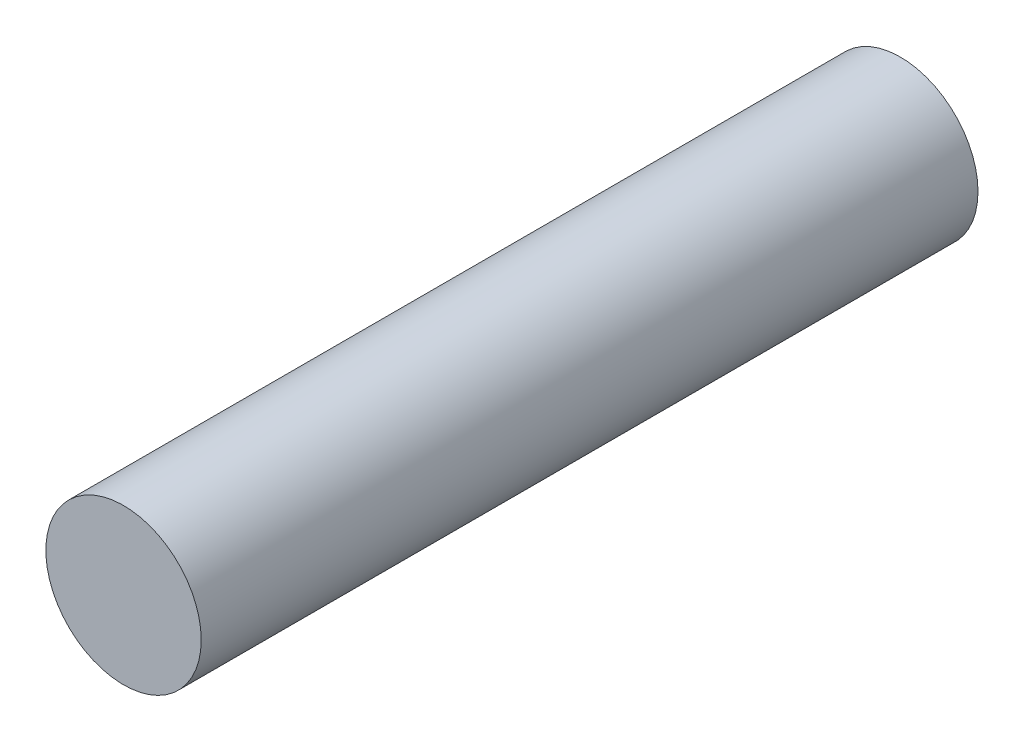
ISO-10303-21;
HEADER;
FILE_DESCRIPTION(('STEP AP214'),'2;1');
FILE_NAME('part.step','',(''),(''),'','','');
FILE_SCHEMA(('AUTOMOTIVE_DESIGN { 1 0 10303 214 1 1 1 1 }'));
ENDSEC;
DATA;
#1=APPLICATION_CONTEXT('core data for automotive mechanical design processes');
#2=APPLICATION_PROTOCOL_DEFINITION('international standard','automotive_design',2000,#1);
#3=PRODUCT_CONTEXT('',#1,'mechanical');
#4=PRODUCT('Part','Part','',(#3));
#5=PRODUCT_RELATED_PRODUCT_CATEGORY('part','',(#4));
#6=PRODUCT_DEFINITION_FORMATION('','',#4);
#7=PRODUCT_DEFINITION_CONTEXT('part definition',#1,'design');
#8=PRODUCT_DEFINITION('design','',#6,#7);
#9=PRODUCT_DEFINITION_SHAPE('','',#8);
#10=(LENGTH_UNIT() NAMED_UNIT(*) SI_UNIT(.MILLI.,.METRE.));
#11=(NAMED_UNIT(*) PLANE_ANGLE_UNIT() SI_UNIT($,.RADIAN.));
#12=(NAMED_UNIT(*) SI_UNIT($,.STERADIAN.) SOLID_ANGLE_UNIT());
#13=UNCERTAINTY_MEASURE_WITH_UNIT(LENGTH_MEASURE(1.E-05),#10,'distance_accuracy_value','');
#14=(GEOMETRIC_REPRESENTATION_CONTEXT(3) GLOBAL_UNCERTAINTY_ASSIGNED_CONTEXT((#13)) GLOBAL_UNIT_ASSIGNED_CONTEXT((#10,
#11,#12)) REPRESENTATION_CONTEXT('',''));
#15=CARTESIAN_POINT('',(0.,0.,0.));
#16=DIRECTION('',(0.,0.,1.));
#17=DIRECTION('',(1.,0.,0.));
#18=AXIS2_PLACEMENT_3D('',#15,#16,#17);
#19=CARTESIAN_POINT('',(0.,0.,150.));
#20=DIRECTION('',(0.,0.,-1.));
#21=DIRECTION('',(-1.,0.,0.));
#22=AXIS2_PLACEMENT_3D('',#19,#20,#21);
#23=CYLINDRICAL_SURFACE('',#22,15.);
#24=CARTESIAN_POINT('',(0.,0.,150.));
#25=DIRECTION('',(0.,0.,1.));
#26=DIRECTION('',(1.,0.,0.));
#27=AXIS2_PLACEMENT_3D('',#24,#25,#26);
#28=CIRCLE('',#27,15.);
#29=CARTESIAN_POINT('',(15.,0.,150.));
#30=VERTEX_POINT('',#29);
#31=EDGE_CURVE('E10',#30,#30,#28,.T.);
#32=ORIENTED_EDGE('',*,*,#31,.F.);
#33=EDGE_LOOP('',(#32));
#34=FACE_BOUND('',#33,.T.);
#35=CARTESIAN_POINT('',(0.,0.,0.));
#36=DIRECTION('',(0.,0.,1.));
#37=DIRECTION('',(1.,0.,0.));
#38=AXIS2_PLACEMENT_3D('',#35,#36,#37);
#39=CIRCLE('',#38,15.);
#40=CARTESIAN_POINT('',(15.,0.,0.));
#41=VERTEX_POINT('',#40);
#42=EDGE_CURVE('E46',#41,#41,#39,.T.);
#43=ORIENTED_EDGE('',*,*,#42,.T.);
#44=EDGE_LOOP('',(#43));
#45=FACE_BOUND('',#44,.T.);
#46=ADVANCED_FACE('F43',(#34,#45),#23,.T.);
#47=CARTESIAN_POINT('',(0.,0.,150.));
#48=DIRECTION('',(0.,0.,1.));
#49=DIRECTION('',(1.,0.,0.));
#50=AXIS2_PLACEMENT_3D('',#47,#48,#49);
#51=PLANE('',#50);
#52=ORIENTED_EDGE('',*,*,#31,.T.);
#53=EDGE_LOOP('',(#52));
#54=FACE_BOUND('',#53,.T.);
#55=ADVANCED_FACE('F58',(#54),#51,.T.);
#56=CARTESIAN_POINT('',(0.,0.,0.));
#57=DIRECTION('',(0.,0.,1.));
#58=DIRECTION('',(1.,0.,0.));
#59=AXIS2_PLACEMENT_3D('',#56,#57,#58);
#60=PLANE('',#59);
#61=ORIENTED_EDGE('',*,*,#42,.F.);
#62=EDGE_LOOP('',(#61));
#63=FACE_BOUND('',#62,.T.);
#64=ADVANCED_FACE('F56',(#63),#60,.F.);
#65=CLOSED_SHELL('',(#46,#55,#64));
#66=MANIFOLD_SOLID_BREP('B2',#65);
#67=ADVANCED_BREP_SHAPE_REPRESENTATION('',(#18,#66),#14);
#68=SHAPE_DEFINITION_REPRESENTATION(#9,#67);
ENDSEC;
END-ISO-10303-21;
